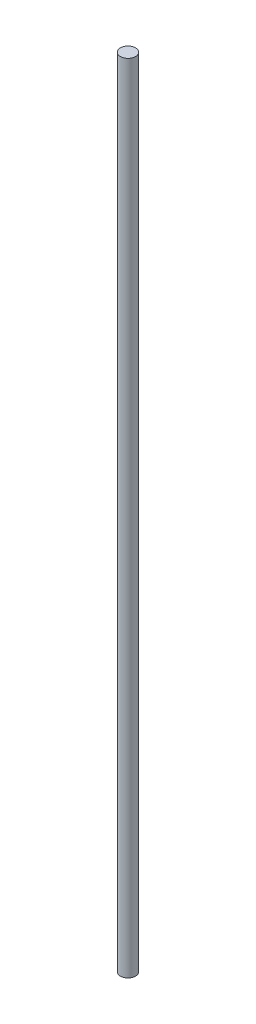
ISO-10303-21;
HEADER;
FILE_DESCRIPTION(('STEP AP214'),'2;1');
FILE_NAME('part.step','',(''),(''),'','','');
FILE_SCHEMA(('AUTOMOTIVE_DESIGN { 1 0 10303 214 1 1 1 1 }'));
ENDSEC;
DATA;
#1=APPLICATION_CONTEXT('core data for automotive mechanical design processes');
#2=APPLICATION_PROTOCOL_DEFINITION('international standard','automotive_design',2000,#1);
#3=PRODUCT_CONTEXT('',#1,'mechanical');
#4=PRODUCT('Part','Part','',(#3));
#5=PRODUCT_RELATED_PRODUCT_CATEGORY('part','',(#4));
#6=PRODUCT_DEFINITION_FORMATION('','',#4);
#7=PRODUCT_DEFINITION_CONTEXT('part definition',#1,'design');
#8=PRODUCT_DEFINITION('design','',#6,#7);
#9=PRODUCT_DEFINITION_SHAPE('','',#8);
#10=(LENGTH_UNIT() NAMED_UNIT(*) SI_UNIT(.MILLI.,.METRE.));
#11=(NAMED_UNIT(*) PLANE_ANGLE_UNIT() SI_UNIT($,.RADIAN.));
#12=(NAMED_UNIT(*) SI_UNIT($,.STERADIAN.) SOLID_ANGLE_UNIT());
#13=UNCERTAINTY_MEASURE_WITH_UNIT(LENGTH_MEASURE(1.E-05),#10,'distance_accuracy_value','');
#14=(GEOMETRIC_REPRESENTATION_CONTEXT(3) GLOBAL_UNCERTAINTY_ASSIGNED_CONTEXT((#13)) GLOBAL_UNIT_ASSIGNED_CONTEXT((#10,
#11,#12)) REPRESENTATION_CONTEXT('',''));
#15=CARTESIAN_POINT('',(0.,0.,0.));
#16=DIRECTION('',(0.,0.,1.));
#17=DIRECTION('',(1.,0.,0.));
#18=AXIS2_PLACEMENT_3D('',#15,#16,#17);
#19=CARTESIAN_POINT('',(0.,315.,0.));
#20=DIRECTION('',(0.,-1.,0.));
#21=DIRECTION('',(0.,0.,-1.));
#22=AXIS2_PLACEMENT_3D('',#19,#20,#21);
#23=CYLINDRICAL_SURFACE('',#22,3.);
#24=CARTESIAN_POINT('',(0.,315.,0.));
#25=DIRECTION('',(0.,1.,0.));
#26=DIRECTION('',(0.,0.,1.));
#27=AXIS2_PLACEMENT_3D('',#24,#25,#26);
#28=CIRCLE('',#27,3.);
#29=CARTESIAN_POINT('',(0.,315.,3.));
#30=VERTEX_POINT('',#29);
#31=EDGE_CURVE('E10',#30,#30,#28,.T.);
#32=ORIENTED_EDGE('',*,*,#31,.F.);
#33=EDGE_LOOP('',(#32));
#34=FACE_BOUND('',#33,.T.);
#35=CARTESIAN_POINT('',(0.,0.,0.));
#36=DIRECTION('',(0.,1.,0.));
#37=DIRECTION('',(0.,0.,1.));
#38=AXIS2_PLACEMENT_3D('',#35,#36,#37);
#39=CIRCLE('',#38,3.);
#40=CARTESIAN_POINT('',(0.,0.,3.));
#41=VERTEX_POINT('',#40);
#42=EDGE_CURVE('E35',#41,#41,#39,.T.);
#43=ORIENTED_EDGE('',*,*,#42,.T.);
#44=EDGE_LOOP('',(#43));
#45=FACE_BOUND('',#44,.T.);
#46=ADVANCED_FACE('F32',(#34,#45),#23,.T.);
#47=CARTESIAN_POINT('',(0.,315.,0.));
#48=DIRECTION('',(0.,1.,0.));
#49=DIRECTION('',(0.,0.,1.));
#50=AXIS2_PLACEMENT_3D('',#47,#48,#49);
#51=PLANE('',#50);
#52=ORIENTED_EDGE('',*,*,#31,.T.);
#53=EDGE_LOOP('',(#52));
#54=FACE_BOUND('',#53,.T.);
#55=ADVANCED_FACE('F47',(#54),#51,.T.);
#56=CARTESIAN_POINT('',(0.,0.,0.));
#57=DIRECTION('',(0.,1.,0.));
#58=DIRECTION('',(0.,0.,1.));
#59=AXIS2_PLACEMENT_3D('',#56,#57,#58);
#60=PLANE('',#59);
#61=ORIENTED_EDGE('',*,*,#42,.F.);
#62=EDGE_LOOP('',(#61));
#63=FACE_BOUND('',#62,.T.);
#64=ADVANCED_FACE('F45',(#63),#60,.F.);
#65=CLOSED_SHELL('',(#46,#55,#64));
#66=MANIFOLD_SOLID_BREP('B2',#65);
#67=ADVANCED_BREP_SHAPE_REPRESENTATION('',(#18,#66),#14);
#68=SHAPE_DEFINITION_REPRESENTATION(#9,#67);
ENDSEC;
END-ISO-10303-21;
